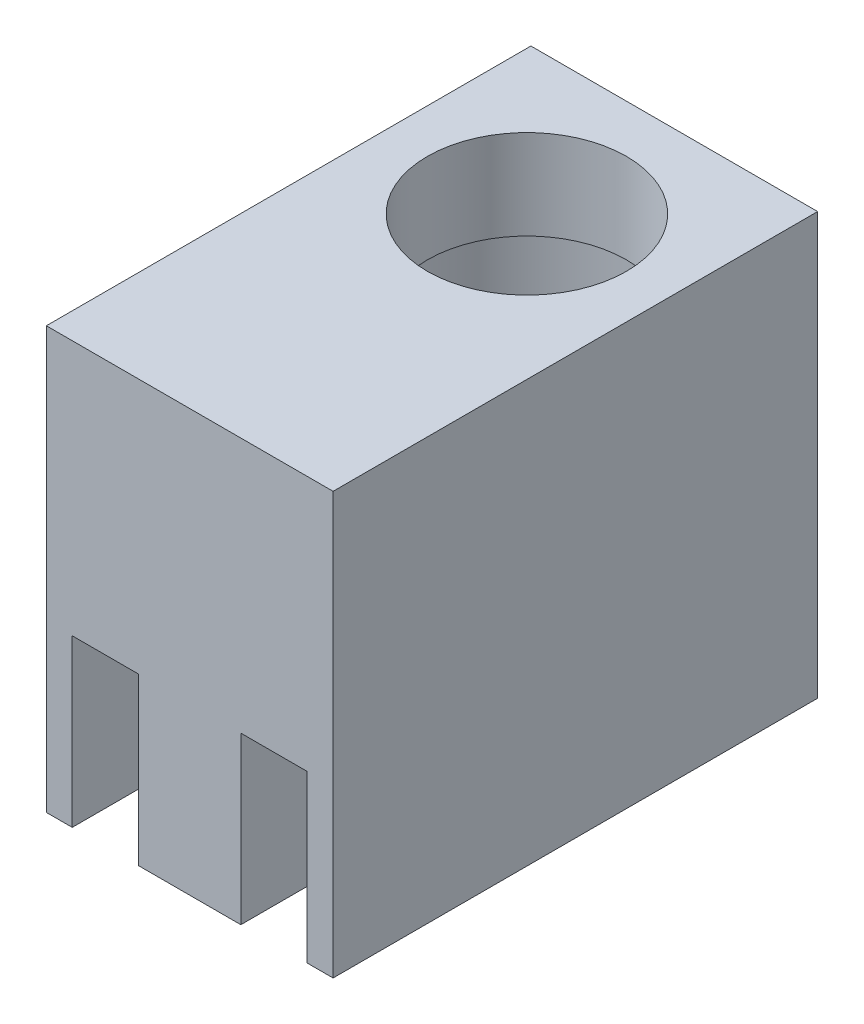
ISO-10303-21;
HEADER;
FILE_DESCRIPTION(('STEP AP214'),'2;1');
FILE_NAME('part.step','',(''),(''),'','','');
FILE_SCHEMA(('AUTOMOTIVE_DESIGN { 1 0 10303 214 1 1 1 1 }'));
ENDSEC;
DATA;
#1=APPLICATION_CONTEXT('core data for automotive mechanical design processes');
#2=APPLICATION_PROTOCOL_DEFINITION('international standard','automotive_design',2000,#1);
#3=PRODUCT_CONTEXT('',#1,'mechanical');
#4=PRODUCT('Part','Part','',(#3));
#5=PRODUCT_RELATED_PRODUCT_CATEGORY('part','',(#4));
#6=PRODUCT_DEFINITION_FORMATION('','',#4);
#7=PRODUCT_DEFINITION_CONTEXT('part definition',#1,'design');
#8=PRODUCT_DEFINITION('design','',#6,#7);
#9=PRODUCT_DEFINITION_SHAPE('','',#8);
#10=(LENGTH_UNIT() NAMED_UNIT(*) SI_UNIT(.MILLI.,.METRE.));
#11=(NAMED_UNIT(*) PLANE_ANGLE_UNIT() SI_UNIT($,.RADIAN.));
#12=(NAMED_UNIT(*) SI_UNIT($,.STERADIAN.) SOLID_ANGLE_UNIT());
#13=UNCERTAINTY_MEASURE_WITH_UNIT(LENGTH_MEASURE(1.E-05),#10,'distance_accuracy_value','');
#14=(GEOMETRIC_REPRESENTATION_CONTEXT(3) GLOBAL_UNCERTAINTY_ASSIGNED_CONTEXT((#13)) GLOBAL_UNIT_ASSIGNED_CONTEXT((#10,
#11,#12)) REPRESENTATION_CONTEXT('',''));
#15=CARTESIAN_POINT('',(0.,0.,0.));
#16=DIRECTION('',(0.,0.,1.));
#17=DIRECTION('',(1.,0.,0.));
#18=AXIS2_PLACEMENT_3D('',#15,#16,#17);
#19=CARTESIAN_POINT('',(0.,0.,0.));
#20=DIRECTION('',(0.,1.,0.));
#21=DIRECTION('',(0.,0.,1.));
#22=AXIS2_PLACEMENT_3D('',#19,#20,#21);
#23=PLANE('',#22);
#24=DIRECTION('',(-1.,0.,0.));
#25=VECTOR('',#24,1.);
#26=CARTESIAN_POINT('',(0.,0.,3.65));
#27=LINE('',#26,#25);
#28=CARTESIAN_POINT('',(0.77,0.,3.65));
#29=VERTEX_POINT('',#28);
#30=CARTESIAN_POINT('',(-0.77,0.,3.65));
#31=VERTEX_POINT('',#30);
#32=EDGE_CURVE('E242',#29,#31,#27,.T.);
#33=ORIENTED_EDGE('',*,*,#32,.T.);
#34=DIRECTION('',(0.,0.,1.));
#35=VECTOR('',#34,1.);
#36=CARTESIAN_POINT('',(-0.77,0.,3.65));
#37=LINE('',#36,#35);
#38=CARTESIAN_POINT('',(-0.77,0.,0.41583314522196));
#39=VERTEX_POINT('',#38);
#40=EDGE_CURVE('E150',#39,#31,#37,.T.);
#41=ORIENTED_EDGE('',*,*,#40,.F.);
#42=CARTESIAN_POINT('',(0.,0.,-1.43));
#43=DIRECTION('',(0.,1.,0.));
#44=DIRECTION('',(0.,0.,1.));
#45=AXIS2_PLACEMENT_3D('',#42,#43,#44);
#46=CIRCLE('',#45,2.);
#47=CARTESIAN_POINT('',(0.77,0.,0.41583314522196));
#48=VERTEX_POINT('',#47);
#49=EDGE_CURVE('E173',#39,#48,#46,.T.);
#50=ORIENTED_EDGE('',*,*,#49,.T.);
#51=DIRECTION('',(0.,0.,-1.));
#52=VECTOR('',#51,1.);
#53=CARTESIAN_POINT('',(0.77,0.,3.65));
#54=LINE('',#53,#52);
#55=EDGE_CURVE('E186',#29,#48,#54,.T.);
#56=ORIENTED_EDGE('',*,*,#55,.F.);
#57=EDGE_LOOP('',(#33,#41,#50,#56));
#58=FACE_BOUND('',#57,.T.);
#59=ADVANCED_FACE('F47',(#58),#23,.F.);
#60=CARTESIAN_POINT('',(-2.16,6.35,0.));
#61=DIRECTION('',(-1.,0.,0.));
#62=DIRECTION('',(0.,0.,1.));
#63=AXIS2_PLACEMENT_3D('',#60,#61,#62);
#64=PLANE('',#63);
#65=DIRECTION('',(0.,0.,-1.));
#66=VECTOR('',#65,1.);
#67=CARTESIAN_POINT('',(-2.16,0.,0.));
#68=LINE('',#67,#66);
#69=CARTESIAN_POINT('',(-2.16,0.,3.65));
#70=VERTEX_POINT('',#69);
#71=CARTESIAN_POINT('',(-2.16,0.,-3.65));
#72=VERTEX_POINT('',#71);
#73=EDGE_CURVE('E209',#70,#72,#68,.T.);
#74=ORIENTED_EDGE('',*,*,#73,.F.);
#75=DIRECTION('',(0.,-1.,0.));
#76=VECTOR('',#75,1.);
#77=CARTESIAN_POINT('',(-2.16,6.35,3.65));
#78=LINE('',#77,#76);
#79=CARTESIAN_POINT('',(-2.16,6.35,3.65));
#80=VERTEX_POINT('',#79);
#81=EDGE_CURVE('E257',#80,#70,#78,.T.);
#82=ORIENTED_EDGE('',*,*,#81,.F.);
#83=DIRECTION('',(0.,0.,-1.));
#84=VECTOR('',#83,1.);
#85=CARTESIAN_POINT('',(-2.16,6.35,0.));
#86=LINE('',#85,#84);
#87=CARTESIAN_POINT('',(-2.16,6.35,-3.65));
#88=VERTEX_POINT('',#87);
#89=EDGE_CURVE('E213',#80,#88,#86,.T.);
#90=ORIENTED_EDGE('',*,*,#89,.T.);
#91=DIRECTION('',(0.,-1.,0.));
#92=VECTOR('',#91,1.);
#93=CARTESIAN_POINT('',(-2.16,6.35,-3.65));
#94=LINE('',#93,#92);
#95=EDGE_CURVE('E232',#88,#72,#94,.T.);
#96=ORIENTED_EDGE('',*,*,#95,.T.);
#97=EDGE_LOOP('',(#74,#82,#90,#96));
#98=FACE_BOUND('',#97,.T.);
#99=ADVANCED_FACE('F49',(#98),#64,.T.);
#100=CARTESIAN_POINT('',(0.,6.35,3.65));
#101=DIRECTION('',(0.,0.,1.));
#102=DIRECTION('',(1.,0.,0.));
#103=AXIS2_PLACEMENT_3D('',#100,#101,#102);
#104=PLANE('',#103);
#105=DIRECTION('',(0.,-1.,0.));
#106=VECTOR('',#105,1.);
#107=CARTESIAN_POINT('',(-0.77,2.5,3.65));
#108=LINE('',#107,#106);
#109=CARTESIAN_POINT('',(-0.77,2.5,3.65));
#110=VERTEX_POINT('',#109);
#111=EDGE_CURVE('E147',#110,#31,#108,.T.);
#112=ORIENTED_EDGE('',*,*,#111,.T.);
#113=ORIENTED_EDGE('',*,*,#32,.F.);
#114=DIRECTION('',(0.,-1.,0.));
#115=VECTOR('',#114,1.);
#116=CARTESIAN_POINT('',(0.77,2.5,3.65));
#117=LINE('',#116,#115);
#118=CARTESIAN_POINT('',(0.77,2.5,3.65));
#119=VERTEX_POINT('',#118);
#120=EDGE_CURVE('E180',#119,#29,#117,.T.);
#121=ORIENTED_EDGE('',*,*,#120,.F.);
#122=DIRECTION('',(-1.,0.,0.));
#123=VECTOR('',#122,1.);
#124=CARTESIAN_POINT('',(0.77,2.5,3.65));
#125=LINE('',#124,#123);
#126=CARTESIAN_POINT('',(1.77,2.5,3.65));
#127=VERTEX_POINT('',#126);
#128=EDGE_CURVE('E194',#127,#119,#125,.T.);
#129=ORIENTED_EDGE('',*,*,#128,.F.);
#130=DIRECTION('',(0.,-1.,0.));
#131=VECTOR('',#130,1.);
#132=CARTESIAN_POINT('',(1.77,2.5,3.65));
#133=LINE('',#132,#131);
#134=CARTESIAN_POINT('',(1.77,0.,3.65));
#135=VERTEX_POINT('',#134);
#136=EDGE_CURVE('E176',#127,#135,#133,.T.);
#137=ORIENTED_EDGE('',*,*,#136,.T.);
#138=CARTESIAN_POINT('',(2.16,0.,3.65));
#139=VERTEX_POINT('',#138);
#140=EDGE_CURVE('E237',#139,#135,#27,.T.);
#141=ORIENTED_EDGE('',*,*,#140,.F.);
#142=DIRECTION('',(0.,-1.,0.));
#143=VECTOR('',#142,1.);
#144=CARTESIAN_POINT('',(2.16,6.35,3.65));
#145=LINE('',#144,#143);
#146=CARTESIAN_POINT('',(2.16,6.35,3.65));
#147=VERTEX_POINT('',#146);
#148=EDGE_CURVE('E254',#147,#139,#145,.T.);
#149=ORIENTED_EDGE('',*,*,#148,.F.);
#150=DIRECTION('',(-1.,0.,0.));
#151=VECTOR('',#150,1.);
#152=CARTESIAN_POINT('',(0.,6.35,3.65));
#153=LINE('',#152,#151);
#154=EDGE_CURVE('E217',#147,#80,#153,.T.);
#155=ORIENTED_EDGE('',*,*,#154,.T.);
#156=ORIENTED_EDGE('',*,*,#81,.T.);
#157=CARTESIAN_POINT('',(-1.77,0.,3.65));
#158=VERTEX_POINT('',#157);
#159=EDGE_CURVE('E236',#158,#70,#27,.T.);
#160=ORIENTED_EDGE('',*,*,#159,.F.);
#161=DIRECTION('',(0.,-1.,0.));
#162=VECTOR('',#161,1.);
#163=CARTESIAN_POINT('',(-1.77,2.5,3.65));
#164=LINE('',#163,#162);
#165=CARTESIAN_POINT('',(-1.77,2.5,3.65));
#166=VERTEX_POINT('',#165);
#167=EDGE_CURVE('E155',#166,#158,#164,.T.);
#168=ORIENTED_EDGE('',*,*,#167,.F.);
#169=DIRECTION('',(-1.,0.,0.));
#170=VECTOR('',#169,1.);
#171=CARTESIAN_POINT('',(-1.77,2.5,3.65));
#172=LINE('',#171,#170);
#173=EDGE_CURVE('E138',#110,#166,#172,.T.);
#174=ORIENTED_EDGE('',*,*,#173,.F.);
#175=EDGE_LOOP('',(#112,#113,#121,#129,#137,#141,#149,#155,#156,#160,#168,#174));
#176=FACE_BOUND('',#175,.T.);
#177=ADVANCED_FACE('F157',(#176),#104,.T.);
#178=CARTESIAN_POINT('',(2.16,6.35,0.));
#179=DIRECTION('',(-1.,0.,0.));
#180=DIRECTION('',(0.,0.,1.));
#181=AXIS2_PLACEMENT_3D('',#178,#179,#180);
#182=PLANE('',#181);
#183=DIRECTION('',(0.,0.,-1.));
#184=VECTOR('',#183,1.);
#185=CARTESIAN_POINT('',(2.16,0.,0.));
#186=LINE('',#185,#184);
#187=CARTESIAN_POINT('',(2.16,0.,-3.65));
#188=VERTEX_POINT('',#187);
#189=EDGE_CURVE('E241',#139,#188,#186,.T.);
#190=ORIENTED_EDGE('',*,*,#189,.T.);
#191=DIRECTION('',(0.,-1.,0.));
#192=VECTOR('',#191,1.);
#193=CARTESIAN_POINT('',(2.16,6.35,-3.65));
#194=LINE('',#193,#192);
#195=CARTESIAN_POINT('',(2.16,6.35,-3.65));
#196=VERTEX_POINT('',#195);
#197=EDGE_CURVE('E250',#196,#188,#194,.T.);
#198=ORIENTED_EDGE('',*,*,#197,.F.);
#199=DIRECTION('',(0.,0.,-1.));
#200=VECTOR('',#199,1.);
#201=CARTESIAN_POINT('',(2.16,6.35,0.));
#202=LINE('',#201,#200);
#203=EDGE_CURVE('E222',#147,#196,#202,.T.);
#204=ORIENTED_EDGE('',*,*,#203,.F.);
#205=ORIENTED_EDGE('',*,*,#148,.T.);
#206=EDGE_LOOP('',(#190,#198,#204,#205));
#207=FACE_BOUND('',#206,.T.);
#208=ADVANCED_FACE('F462',(#207),#182,.F.);
#209=CARTESIAN_POINT('',(0.,6.35,-3.65));
#210=DIRECTION('',(0.,0.,1.));
#211=DIRECTION('',(1.,0.,0.));
#212=AXIS2_PLACEMENT_3D('',#209,#210,#211);
#213=PLANE('',#212);
#214=DIRECTION('',(-1.,0.,0.));
#215=VECTOR('',#214,1.);
#216=CARTESIAN_POINT('',(0.,0.,-3.65));
#217=LINE('',#216,#215);
#218=EDGE_CURVE('E218',#188,#72,#217,.T.);
#219=ORIENTED_EDGE('',*,*,#218,.T.);
#220=ORIENTED_EDGE('',*,*,#95,.F.);
#221=DIRECTION('',(-1.,0.,0.));
#222=VECTOR('',#221,1.);
#223=CARTESIAN_POINT('',(0.,6.35,-3.65));
#224=LINE('',#223,#222);
#225=EDGE_CURVE('E225',#196,#88,#224,.T.);
#226=ORIENTED_EDGE('',*,*,#225,.F.);
#227=ORIENTED_EDGE('',*,*,#197,.T.);
#228=EDGE_LOOP('',(#219,#220,#226,#227));
#229=FACE_BOUND('',#228,.T.);
#230=ADVANCED_FACE('F291',(#229),#213,.F.);
#231=CARTESIAN_POINT('',(0.,6.35,-1.43));
#232=DIRECTION('',(0.,-1.,0.));
#233=DIRECTION('',(0.,0.,-1.));
#234=AXIS2_PLACEMENT_3D('',#231,#232,#233);
#235=CYLINDRICAL_SURFACE('',#234,1.5);
#236=CARTESIAN_POINT('',(0.,5.,-1.43));
#237=DIRECTION('',(0.,1.,0.));
#238=DIRECTION('',(0.,0.,1.));
#239=AXIS2_PLACEMENT_3D('',#236,#237,#238);
#240=CIRCLE('',#239,1.5);
#241=CARTESIAN_POINT('',(0.,5.,0.0699999999999987));
#242=VERTEX_POINT('',#241);
#243=EDGE_CURVE('E200',#242,#242,#240,.T.);
#244=ORIENTED_EDGE('',*,*,#243,.F.);
#245=EDGE_LOOP('',(#244));
#246=FACE_BOUND('',#245,.T.);
#247=CARTESIAN_POINT('',(0.,6.35,-1.43));
#248=DIRECTION('',(0.,1.,0.));
#249=DIRECTION('',(0.,0.,1.));
#250=AXIS2_PLACEMENT_3D('',#247,#248,#249);
#251=CIRCLE('',#250,1.5);
#252=CARTESIAN_POINT('',(0.,6.35,0.0699999999999987));
#253=VERTEX_POINT('',#252);
#254=EDGE_CURVE('E228',#253,#253,#251,.T.);
#255=ORIENTED_EDGE('',*,*,#254,.T.);
#256=EDGE_LOOP('',(#255));
#257=FACE_BOUND('',#256,.T.);
#258=ADVANCED_FACE('F330',(#246,#257),#235,.F.);
#259=CARTESIAN_POINT('',(0.,6.35,0.));
#260=DIRECTION('',(0.,1.,0.));
#261=DIRECTION('',(0.,0.,1.));
#262=AXIS2_PLACEMENT_3D('',#259,#260,#261);
#263=PLANE('',#262);
#264=ORIENTED_EDGE('',*,*,#89,.F.);
#265=ORIENTED_EDGE('',*,*,#154,.F.);
#266=ORIENTED_EDGE('',*,*,#203,.T.);
#267=ORIENTED_EDGE('',*,*,#225,.T.);
#268=EDGE_LOOP('',(#264,#265,#266,#267));
#269=FACE_BOUND('',#268,.T.);
#270=ORIENTED_EDGE('',*,*,#254,.F.);
#271=EDGE_LOOP('',(#270));
#272=FACE_BOUND('',#271,.T.);
#273=ADVANCED_FACE('F324',(#269,#272),#263,.T.);
#274=CARTESIAN_POINT('',(1.77,0.,-0.49881795549957));
#275=VERTEX_POINT('',#274);
#276=CARTESIAN_POINT('',(-1.77,0.,-0.49881795549957));
#277=VERTEX_POINT('',#276);
#278=EDGE_CURVE('E205',#275,#277,#46,.T.);
#279=ORIENTED_EDGE('',*,*,#278,.T.);
#280=DIRECTION('',(0.,0.,-1.));
#281=VECTOR('',#280,1.);
#282=CARTESIAN_POINT('',(-1.77,0.,3.65));
#283=LINE('',#282,#281);
#284=EDGE_CURVE('E144',#158,#277,#283,.T.);
#285=ORIENTED_EDGE('',*,*,#284,.F.);
#286=ORIENTED_EDGE('',*,*,#159,.T.);
#287=ORIENTED_EDGE('',*,*,#73,.T.);
#288=ORIENTED_EDGE('',*,*,#218,.F.);
#289=ORIENTED_EDGE('',*,*,#189,.F.);
#290=ORIENTED_EDGE('',*,*,#140,.T.);
#291=DIRECTION('',(0.,0.,1.));
#292=VECTOR('',#291,1.);
#293=CARTESIAN_POINT('',(1.77,0.,3.65));
#294=LINE('',#293,#292);
#295=EDGE_CURVE('E166',#275,#135,#294,.T.);
#296=ORIENTED_EDGE('',*,*,#295,.F.);
#297=EDGE_LOOP('',(#279,#285,#286,#287,#288,#289,#290,#296));
#298=FACE_BOUND('',#297,.T.);
#299=ADVANCED_FACE('F282',(#298),#23,.F.);
#300=CARTESIAN_POINT('',(0.,5.,-1.43));
#301=DIRECTION('',(0.,-1.,0.));
#302=DIRECTION('',(0.,0.,-1.));
#303=AXIS2_PLACEMENT_3D('',#300,#301,#302);
#304=CYLINDRICAL_SURFACE('',#303,2.);
#305=DIRECTION('',(0.,-1.,0.));
#306=VECTOR('',#305,1.);
#307=CARTESIAN_POINT('',(-0.77,5.,0.41583314522196));
#308=LINE('',#307,#306);
#309=CARTESIAN_POINT('',(-0.77,2.5,0.41583314522196));
#310=VERTEX_POINT('',#309);
#311=EDGE_CURVE('E11',#310,#39,#308,.T.);
#312=ORIENTED_EDGE('',*,*,#311,.F.);
#313=CARTESIAN_POINT('',(0.,2.5,-1.43));
#314=DIRECTION('',(0.,-1.,0.));
#315=DIRECTION('',(0.,0.,-1.));
#316=AXIS2_PLACEMENT_3D('',#313,#314,#315);
#317=CIRCLE('',#316,2.);
#318=CARTESIAN_POINT('',(-1.77,2.5,-0.498817955499571));
#319=VERTEX_POINT('',#318);
#320=EDGE_CURVE('E56',#310,#319,#317,.T.);
#321=ORIENTED_EDGE('',*,*,#320,.T.);
#322=DIRECTION('',(0.,-1.,0.));
#323=VECTOR('',#322,1.);
#324=CARTESIAN_POINT('',(-1.77,2.5,-0.49881795549957));
#325=LINE('',#324,#323);
#326=EDGE_CURVE('E169',#319,#277,#325,.T.);
#327=ORIENTED_EDGE('',*,*,#326,.T.);
#328=ORIENTED_EDGE('',*,*,#278,.F.);
#329=DIRECTION('',(0.,-1.,0.));
#330=VECTOR('',#329,1.);
#331=CARTESIAN_POINT('',(1.77,2.5,-0.49881795549957));
#332=LINE('',#331,#330);
#333=CARTESIAN_POINT('',(1.77,2.5,-0.49881795549957));
#334=VERTEX_POINT('',#333);
#335=EDGE_CURVE('E183',#334,#275,#332,.T.);
#336=ORIENTED_EDGE('',*,*,#335,.F.);
#337=CARTESIAN_POINT('',(0.,2.5,-1.43));
#338=DIRECTION('',(0.,-1.,0.));
#339=DIRECTION('',(0.,0.,-1.));
#340=AXIS2_PLACEMENT_3D('',#337,#338,#339);
#341=CIRCLE('',#340,2.);
#342=CARTESIAN_POINT('',(0.77,2.5,0.41583314522196));
#343=VERTEX_POINT('',#342);
#344=EDGE_CURVE('E261',#334,#343,#341,.T.);
#345=ORIENTED_EDGE('',*,*,#344,.T.);
#346=DIRECTION('',(0.,-1.,0.));
#347=VECTOR('',#346,1.);
#348=CARTESIAN_POINT('',(0.77,5.,0.41583314522196));
#349=LINE('',#348,#347);
#350=EDGE_CURVE('E265',#48,#343,#349,.F.);
#351=ORIENTED_EDGE('',*,*,#350,.F.);
#352=ORIENTED_EDGE('',*,*,#49,.F.);
#353=EDGE_LOOP('',(#312,#321,#327,#328,#336,#345,#351,#352));
#354=FACE_BOUND('',#353,.T.);
#355=CARTESIAN_POINT('',(0.,5.,-1.43));
#356=DIRECTION('',(0.,1.,0.));
#357=DIRECTION('',(0.,0.,1.));
#358=AXIS2_PLACEMENT_3D('',#355,#356,#357);
#359=CIRCLE('',#358,2.);
#360=CARTESIAN_POINT('',(0.,5.,0.569999999999999));
#361=VERTEX_POINT('',#360);
#362=EDGE_CURVE('E204',#361,#361,#359,.T.);
#363=ORIENTED_EDGE('',*,*,#362,.T.);
#364=EDGE_LOOP('',(#363));
#365=FACE_BOUND('',#364,.T.);
#366=ADVANCED_FACE('F269',(#354,#365),#304,.F.);
#367=CARTESIAN_POINT('',(0.,5.,0.));
#368=DIRECTION('',(0.,1.,0.));
#369=DIRECTION('',(0.,0.,1.));
#370=AXIS2_PLACEMENT_3D('',#367,#368,#369);
#371=PLANE('',#370);
#372=ORIENTED_EDGE('',*,*,#243,.T.);
#373=EDGE_LOOP('',(#372));
#374=FACE_BOUND('',#373,.T.);
#375=ORIENTED_EDGE('',*,*,#362,.F.);
#376=EDGE_LOOP('',(#375));
#377=FACE_BOUND('',#376,.T.);
#378=ADVANCED_FACE('F314',(#374,#377),#371,.F.);
#379=CARTESIAN_POINT('',(1.77,2.5,3.65));
#380=DIRECTION('',(1.,0.,0.));
#381=DIRECTION('',(0.,0.,-1.));
#382=AXIS2_PLACEMENT_3D('',#379,#380,#381);
#383=PLANE('',#382);
#384=ORIENTED_EDGE('',*,*,#295,.T.);
#385=ORIENTED_EDGE('',*,*,#136,.F.);
#386=DIRECTION('',(0.,0.,1.));
#387=VECTOR('',#386,1.);
#388=CARTESIAN_POINT('',(1.77,2.5,3.65));
#389=LINE('',#388,#387);
#390=EDGE_CURVE('E189',#334,#127,#389,.T.);
#391=ORIENTED_EDGE('',*,*,#390,.F.);
#392=ORIENTED_EDGE('',*,*,#335,.T.);
#393=EDGE_LOOP('',(#384,#385,#391,#392));
#394=FACE_BOUND('',#393,.T.);
#395=ADVANCED_FACE('F301',(#394),#383,.F.);
#396=CARTESIAN_POINT('',(0.77,2.5,3.65));
#397=DIRECTION('',(-1.,0.,0.));
#398=DIRECTION('',(0.,0.,1.));
#399=AXIS2_PLACEMENT_3D('',#396,#397,#398);
#400=PLANE('',#399);
#401=ORIENTED_EDGE('',*,*,#350,.T.);
#402=DIRECTION('',(0.,0.,-1.));
#403=VECTOR('',#402,1.);
#404=CARTESIAN_POINT('',(0.77,2.5,3.65));
#405=LINE('',#404,#403);
#406=EDGE_CURVE('E71',#119,#343,#405,.T.);
#407=ORIENTED_EDGE('',*,*,#406,.F.);
#408=ORIENTED_EDGE('',*,*,#120,.T.);
#409=ORIENTED_EDGE('',*,*,#55,.T.);
#410=EDGE_LOOP('',(#401,#407,#408,#409));
#411=FACE_BOUND('',#410,.T.);
#412=ADVANCED_FACE('F306',(#411),#400,.F.);
#413=CARTESIAN_POINT('',(0.,2.5,0.));
#414=DIRECTION('',(0.,-1.,0.));
#415=DIRECTION('',(0.,0.,-1.));
#416=AXIS2_PLACEMENT_3D('',#413,#414,#415);
#417=PLANE('',#416);
#418=ORIENTED_EDGE('',*,*,#390,.T.);
#419=ORIENTED_EDGE('',*,*,#128,.T.);
#420=ORIENTED_EDGE('',*,*,#406,.T.);
#421=ORIENTED_EDGE('',*,*,#344,.F.);
#422=EDGE_LOOP('',(#418,#419,#420,#421));
#423=FACE_BOUND('',#422,.T.);
#424=ADVANCED_FACE('F303',(#423),#417,.T.);
#425=CARTESIAN_POINT('',(-0.77,2.5,3.65));
#426=DIRECTION('',(1.,0.,0.));
#427=DIRECTION('',(0.,0.,-1.));
#428=AXIS2_PLACEMENT_3D('',#425,#426,#427);
#429=PLANE('',#428);
#430=ORIENTED_EDGE('',*,*,#311,.T.);
#431=ORIENTED_EDGE('',*,*,#40,.T.);
#432=ORIENTED_EDGE('',*,*,#111,.F.);
#433=DIRECTION('',(0.,0.,1.));
#434=VECTOR('',#433,1.);
#435=CARTESIAN_POINT('',(-0.77,2.5,3.65));
#436=LINE('',#435,#434);
#437=EDGE_CURVE('E134',#310,#110,#436,.T.);
#438=ORIENTED_EDGE('',*,*,#437,.F.);
#439=EDGE_LOOP('',(#430,#431,#432,#438));
#440=FACE_BOUND('',#439,.T.);
#441=ADVANCED_FACE('F148',(#440),#429,.F.);
#442=CARTESIAN_POINT('',(-1.77,2.5,3.65));
#443=DIRECTION('',(-1.,0.,0.));
#444=DIRECTION('',(0.,0.,1.));
#445=AXIS2_PLACEMENT_3D('',#442,#443,#444);
#446=PLANE('',#445);
#447=ORIENTED_EDGE('',*,*,#284,.T.);
#448=ORIENTED_EDGE('',*,*,#326,.F.);
#449=DIRECTION('',(0.,0.,-1.));
#450=VECTOR('',#449,1.);
#451=CARTESIAN_POINT('',(-1.77,2.5,3.65));
#452=LINE('',#451,#450);
#453=EDGE_CURVE('E63',#166,#319,#452,.T.);
#454=ORIENTED_EDGE('',*,*,#453,.F.);
#455=ORIENTED_EDGE('',*,*,#167,.T.);
#456=EDGE_LOOP('',(#447,#448,#454,#455));
#457=FACE_BOUND('',#456,.T.);
#458=ADVANCED_FACE('F373',(#457),#446,.F.);
#459=CARTESIAN_POINT('',(0.,2.5,0.));
#460=DIRECTION('',(0.,-1.,0.));
#461=DIRECTION('',(0.,0.,-1.));
#462=AXIS2_PLACEMENT_3D('',#459,#460,#461);
#463=PLANE('',#462);
#464=ORIENTED_EDGE('',*,*,#437,.T.);
#465=ORIENTED_EDGE('',*,*,#173,.T.);
#466=ORIENTED_EDGE('',*,*,#453,.T.);
#467=ORIENTED_EDGE('',*,*,#320,.F.);
#468=EDGE_LOOP('',(#464,#465,#466,#467));
#469=FACE_BOUND('',#468,.T.);
#470=ADVANCED_FACE('F136',(#469),#463,.T.);
#471=CLOSED_SHELL('',(#59,#99,#177,#208,#230,#258,#273,#299,#366,#378,#395,#412,#424,#441,#458,#470));
#472=MANIFOLD_SOLID_BREP('B2',#471);
#473=ADVANCED_BREP_SHAPE_REPRESENTATION('',(#18,#472),#14);
#474=SHAPE_DEFINITION_REPRESENTATION(#9,#473);
ENDSEC;
END-ISO-10303-21;
